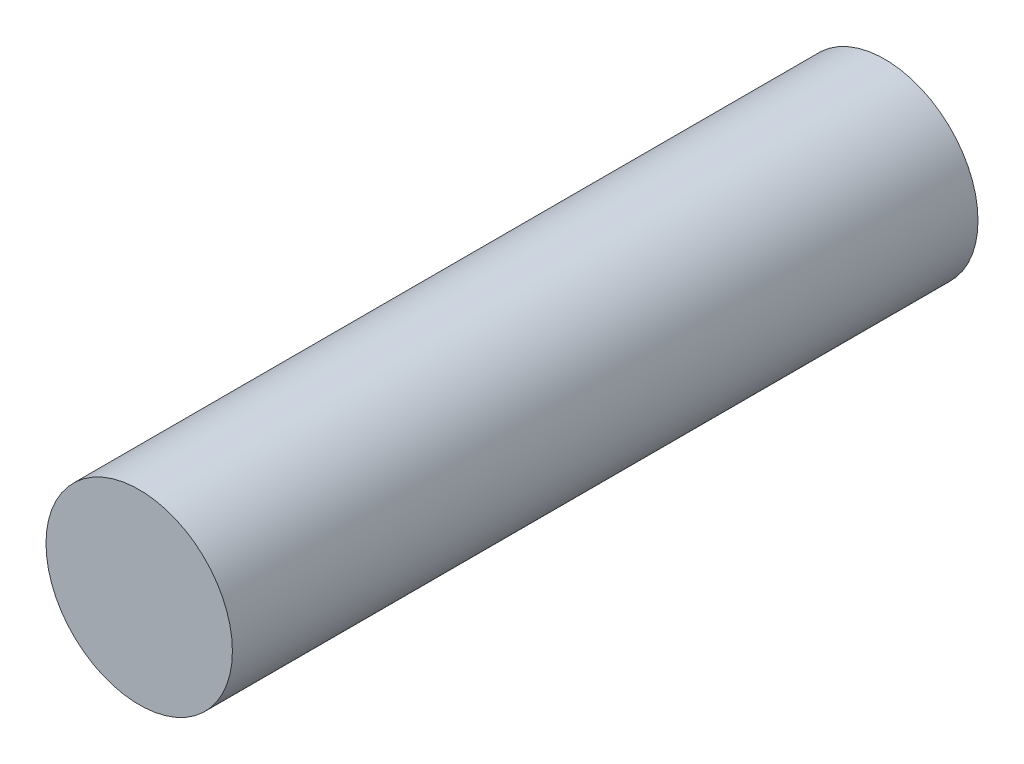
ISO-10303-21;
HEADER;
FILE_DESCRIPTION(('STEP AP214'),'2;1');
FILE_NAME('part.step','',(''),(''),'','','');
FILE_SCHEMA(('AUTOMOTIVE_DESIGN { 1 0 10303 214 1 1 1 1 }'));
ENDSEC;
DATA;
#1=APPLICATION_CONTEXT('core data for automotive mechanical design processes');
#2=APPLICATION_PROTOCOL_DEFINITION('international standard','automotive_design',2000,#1);
#3=PRODUCT_CONTEXT('',#1,'mechanical');
#4=PRODUCT('Part','Part','',(#3));
#5=PRODUCT_RELATED_PRODUCT_CATEGORY('part','',(#4));
#6=PRODUCT_DEFINITION_FORMATION('','',#4);
#7=PRODUCT_DEFINITION_CONTEXT('part definition',#1,'design');
#8=PRODUCT_DEFINITION('design','',#6,#7);
#9=PRODUCT_DEFINITION_SHAPE('','',#8);
#10=(LENGTH_UNIT() NAMED_UNIT(*) SI_UNIT(.MILLI.,.METRE.));
#11=(NAMED_UNIT(*) PLANE_ANGLE_UNIT() SI_UNIT($,.RADIAN.));
#12=(NAMED_UNIT(*) SI_UNIT($,.STERADIAN.) SOLID_ANGLE_UNIT());
#13=UNCERTAINTY_MEASURE_WITH_UNIT(LENGTH_MEASURE(1.E-05),#10,'distance_accuracy_value','');
#14=(GEOMETRIC_REPRESENTATION_CONTEXT(3) GLOBAL_UNCERTAINTY_ASSIGNED_CONTEXT((#13)) GLOBAL_UNIT_ASSIGNED_CONTEXT((#10,
#11,#12)) REPRESENTATION_CONTEXT('',''));
#15=CARTESIAN_POINT('',(0.,0.,0.));
#16=DIRECTION('',(0.,0.,1.));
#17=DIRECTION('',(1.,0.,0.));
#18=AXIS2_PLACEMENT_3D('',#15,#16,#17);
#19=CARTESIAN_POINT('',(0.,0.,152.4));
#20=DIRECTION('',(0.,0.,-1.));
#21=DIRECTION('',(-1.,0.,0.));
#22=AXIS2_PLACEMENT_3D('',#19,#20,#21);
#23=CYLINDRICAL_SURFACE('',#22,38.1);
#24=CARTESIAN_POINT('',(0.,0.,152.4));
#25=DIRECTION('',(0.,0.,1.));
#26=DIRECTION('',(1.,0.,0.));
#27=AXIS2_PLACEMENT_3D('',#24,#25,#26);
#28=CIRCLE('',#27,38.1);
#29=CARTESIAN_POINT('',(-38.1,0.,152.4));
#30=VERTEX_POINT('',#29);
#31=EDGE_CURVE('E10',#30,#30,#28,.T.);
#32=CARTESIAN_POINT('',(0.,0.,-152.4));
#33=DIRECTION('',(0.,0.,1.));
#34=DIRECTION('',(1.,0.,0.));
#35=AXIS2_PLACEMENT_3D('',#32,#33,#34);
#36=CIRCLE('',#35,38.1);
#37=CARTESIAN_POINT('',(-38.1,0.,-152.4));
#38=VERTEX_POINT('',#37);
#39=EDGE_CURVE('E44',#38,#38,#36,.T.);
#40=CARTESIAN_POINT('',(-38.1,0.,152.4));
#41=CARTESIAN_POINT('',(-38.1,0.,149.225));
#42=CARTESIAN_POINT('',(-38.1,0.,146.05));
#43=CARTESIAN_POINT('',(-38.1,0.,139.7));
#44=CARTESIAN_POINT('',(-38.1,0.,136.525));
#45=CARTESIAN_POINT('',(-38.1,0.,130.175));
#46=CARTESIAN_POINT('',(-38.1,0.,127.));
#47=CARTESIAN_POINT('',(-38.1,0.,120.65));
#48=CARTESIAN_POINT('',(-38.1,0.,117.475));
#49=CARTESIAN_POINT('',(-38.1,0.,111.125));
#50=CARTESIAN_POINT('',(-38.1,0.,107.95));
#51=CARTESIAN_POINT('',(-38.1,0.,101.6));
#52=CARTESIAN_POINT('',(-38.1,0.,98.425));
#53=CARTESIAN_POINT('',(-38.1,0.,92.075));
#54=CARTESIAN_POINT('',(-38.1,0.,88.9));
#55=CARTESIAN_POINT('',(-38.1,0.,82.55));
#56=CARTESIAN_POINT('',(-38.1,0.,79.375));
#57=CARTESIAN_POINT('',(-38.1,0.,73.025));
#58=CARTESIAN_POINT('',(-38.1,0.,69.85));
#59=CARTESIAN_POINT('',(-38.1,0.,63.5));
#60=CARTESIAN_POINT('',(-38.1,0.,60.325));
#61=CARTESIAN_POINT('',(-38.1,0.,53.975));
#62=CARTESIAN_POINT('',(-38.1,0.,50.8));
#63=CARTESIAN_POINT('',(-38.1,0.,44.45));
#64=CARTESIAN_POINT('',(-38.1,0.,41.275));
#65=CARTESIAN_POINT('',(-38.1,0.,34.925));
#66=CARTESIAN_POINT('',(-38.1,0.,31.75));
#67=CARTESIAN_POINT('',(-38.1,0.,25.4));
#68=CARTESIAN_POINT('',(-38.1,0.,22.225));
#69=CARTESIAN_POINT('',(-38.1,0.,15.875));
#70=CARTESIAN_POINT('',(-38.1,0.,12.7));
#71=CARTESIAN_POINT('',(-38.1,0.,6.35));
#72=CARTESIAN_POINT('',(-38.1,0.,3.175));
#73=CARTESIAN_POINT('',(-38.1,0.,-3.175));
#74=CARTESIAN_POINT('',(-38.1,0.,-6.35));
#75=CARTESIAN_POINT('',(-38.1,0.,-12.7));
#76=CARTESIAN_POINT('',(-38.1,0.,-15.875));
#77=CARTESIAN_POINT('',(-38.1,0.,-22.225));
#78=CARTESIAN_POINT('',(-38.1,0.,-25.4));
#79=CARTESIAN_POINT('',(-38.1,0.,-31.75));
#80=CARTESIAN_POINT('',(-38.1,0.,-34.925));
#81=CARTESIAN_POINT('',(-38.1,0.,-41.275));
#82=CARTESIAN_POINT('',(-38.1,0.,-44.45));
#83=CARTESIAN_POINT('',(-38.1,0.,-50.8));
#84=CARTESIAN_POINT('',(-38.1,0.,-53.975));
#85=CARTESIAN_POINT('',(-38.1,0.,-60.325));
#86=CARTESIAN_POINT('',(-38.1,0.,-63.5));
#87=CARTESIAN_POINT('',(-38.1,0.,-69.85));
#88=CARTESIAN_POINT('',(-38.1,0.,-73.025));
#89=CARTESIAN_POINT('',(-38.1,0.,-79.375));
#90=CARTESIAN_POINT('',(-38.1,0.,-82.55));
#91=CARTESIAN_POINT('',(-38.1,0.,-88.9));
#92=CARTESIAN_POINT('',(-38.1,0.,-92.075));
#93=CARTESIAN_POINT('',(-38.1,0.,-98.425));
#94=CARTESIAN_POINT('',(-38.1,0.,-101.6));
#95=CARTESIAN_POINT('',(-38.1,0.,-107.95));
#96=CARTESIAN_POINT('',(-38.1,0.,-111.125));
#97=CARTESIAN_POINT('',(-38.1,0.,-117.475));
#98=CARTESIAN_POINT('',(-38.1,0.,-120.65));
#99=CARTESIAN_POINT('',(-38.1,0.,-127.));
#100=CARTESIAN_POINT('',(-38.1,0.,-130.175));
#101=CARTESIAN_POINT('',(-38.1,0.,-136.525));
#102=CARTESIAN_POINT('',(-38.1,0.,-139.7));
#103=CARTESIAN_POINT('',(-38.1,0.,-146.05));
#104=CARTESIAN_POINT('',(-38.1,0.,-149.225));
#105=CARTESIAN_POINT('',(-38.1,0.,-152.4));
#106=B_SPLINE_CURVE_WITH_KNOTS('',3,(#40,#41,#42,#43,#44,#45,#46,#47,#48,#49,#50,#51,#52,#53,
#54,#55,#56,#57,#58,#59,#60,#61,#62,#63,#64,#65,#66,#67,#68,#69,#70,#71,#72,#73,#74,#75,#76,#77,
#78,#79,#80,#81,#82,#83,#84,#85,#86,#87,#88,#89,#90,#91,#92,#93,#94,#95,#96,#97,#98,#99,#100,
#101,#102,#103,#104,#105),.UNSPECIFIED.,.F.,.F.,(4,2,2,2,2,2,2,2,2,2,2,2,2,2,2,2,2,2,2,2,2,2,2,
2,2,2,2,2,2,2,2,2,4),(0.,9.52500000000001,19.05,28.575,38.1,47.625,57.15,66.675,76.2,85.725,
95.25,104.775,114.3,123.825,133.35,142.875,152.4,161.925,171.45,180.975,190.5,200.025,209.55,
219.075,228.6,238.125,247.65,257.175,266.7,276.225,285.75,295.275,304.8),.UNSPECIFIED.);
#107=EDGE_CURVE('BSEAM41',#30,#38,#106,.T.);
#108=ORIENTED_EDGE('',*,*,#31,.F.);
#109=ORIENTED_EDGE('',*,*,#39,.T.);
#110=ORIENTED_EDGE('',*,*,#107,.T.);
#111=ORIENTED_EDGE('',*,*,#107,.F.);
#112=EDGE_LOOP('',(#108,#110,#109,#111));
#113=FACE_BOUND('',#112,.T.);
#114=ADVANCED_FACE('F41',(#113),#23,.T.);
#115=CARTESIAN_POINT('',(0.,0.,152.4));
#116=DIRECTION('',(0.,0.,1.));
#117=DIRECTION('',(1.,0.,0.));
#118=AXIS2_PLACEMENT_3D('',#115,#116,#117);
#119=PLANE('',#118);
#120=ORIENTED_EDGE('',*,*,#31,.T.);
#121=EDGE_LOOP('',(#120));
#122=FACE_BOUND('',#121,.T.);
#123=ADVANCED_FACE('F58',(#122),#119,.T.);
#124=CARTESIAN_POINT('',(0.,0.,-152.4));
#125=DIRECTION('',(0.,0.,1.));
#126=DIRECTION('',(1.,0.,0.));
#127=AXIS2_PLACEMENT_3D('',#124,#125,#126);
#128=PLANE('',#127);
#129=ORIENTED_EDGE('',*,*,#39,.F.);
#130=EDGE_LOOP('',(#129));
#131=FACE_BOUND('',#130,.T.);
#132=ADVANCED_FACE('F56',(#131),#128,.F.);
#133=CLOSED_SHELL('',(#114,#123,#132));
#134=MANIFOLD_SOLID_BREP('B2',#133);
#135=ADVANCED_BREP_SHAPE_REPRESENTATION('',(#18,#134),#14);
#136=SHAPE_DEFINITION_REPRESENTATION(#9,#135);
ENDSEC;
END-ISO-10303-21;
